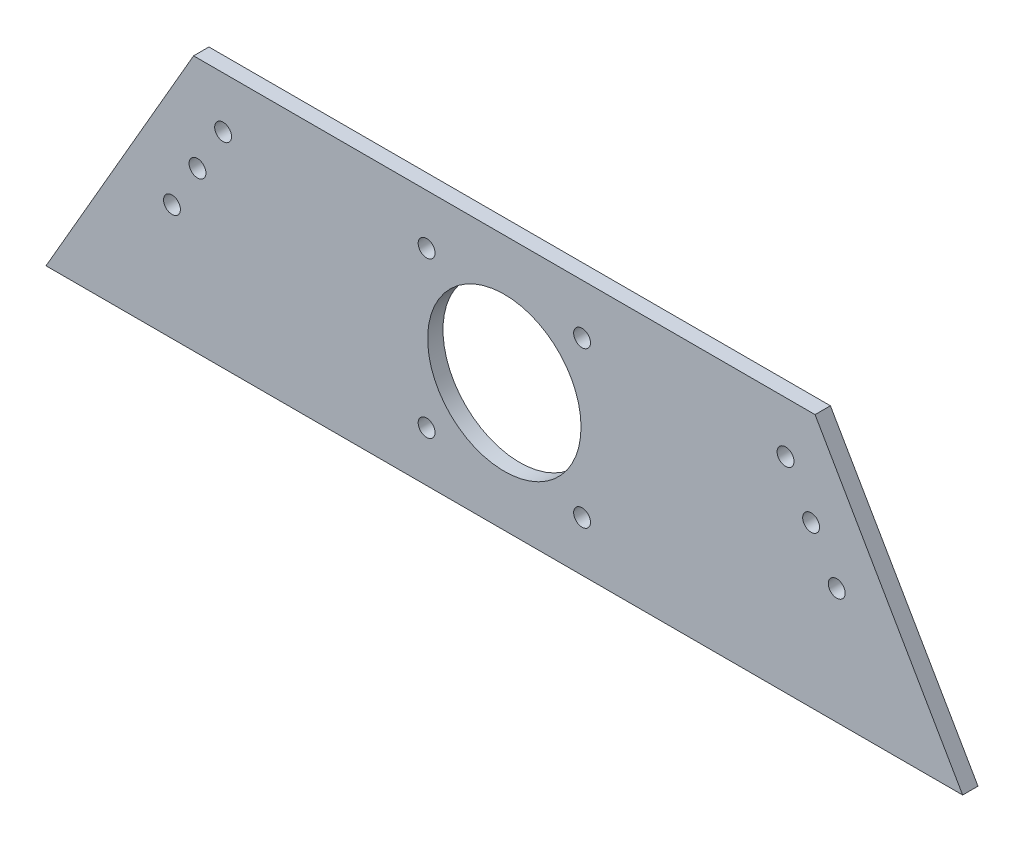
ISO-10303-21;
HEADER;
FILE_DESCRIPTION(('STEP AP214'),'2;1');
FILE_NAME('part.step','',(''),(''),'','','');
FILE_SCHEMA(('AUTOMOTIVE_DESIGN { 1 0 10303 214 1 1 1 1 }'));
ENDSEC;
DATA;
#1=APPLICATION_CONTEXT('core data for automotive mechanical design processes');
#2=APPLICATION_PROTOCOL_DEFINITION('international standard','automotive_design',2000,#1);
#3=PRODUCT_CONTEXT('',#1,'mechanical');
#4=PRODUCT('Part','Part','',(#3));
#5=PRODUCT_RELATED_PRODUCT_CATEGORY('part','',(#4));
#6=PRODUCT_DEFINITION_FORMATION('','',#4);
#7=PRODUCT_DEFINITION_CONTEXT('part definition',#1,'design');
#8=PRODUCT_DEFINITION('design','',#6,#7);
#9=PRODUCT_DEFINITION_SHAPE('','',#8);
#10=(LENGTH_UNIT() NAMED_UNIT(*) SI_UNIT(.MILLI.,.METRE.));
#11=(NAMED_UNIT(*) PLANE_ANGLE_UNIT() SI_UNIT($,.RADIAN.));
#12=(NAMED_UNIT(*) SI_UNIT($,.STERADIAN.) SOLID_ANGLE_UNIT());
#13=UNCERTAINTY_MEASURE_WITH_UNIT(LENGTH_MEASURE(1.E-05),#10,'distance_accuracy_value','');
#14=(GEOMETRIC_REPRESENTATION_CONTEXT(3) GLOBAL_UNCERTAINTY_ASSIGNED_CONTEXT((#13)) GLOBAL_UNIT_ASSIGNED_CONTEXT((#10,
#11,#12)) REPRESENTATION_CONTEXT('',''));
#15=CARTESIAN_POINT('',(0.,0.,0.));
#16=DIRECTION('',(0.,0.,1.));
#17=DIRECTION('',(1.,0.,0.));
#18=AXIS2_PLACEMENT_3D('',#15,#16,#17);
#19=CARTESIAN_POINT('',(0.,0.,3.));
#20=DIRECTION('',(0.,0.,-1.));
#21=DIRECTION('',(-1.,0.,0.));
#22=AXIS2_PLACEMENT_3D('',#19,#20,#21);
#23=PLANE('',#22);
#24=CARTESIAN_POINT('',(-60.,-8.6602540378444,3.));
#25=DIRECTION('',(0.,0.,-1.));
#26=DIRECTION('',(1.,0.,0.));
#27=AXIS2_PLACEMENT_3D('',#24,#25,#26);
#28=CIRCLE('',#27,1.65);
#29=CARTESIAN_POINT('',(-58.35,-8.6602540378444,3.));
#30=VERTEX_POINT('',#29);
#31=EDGE_CURVE('E188',#30,#30,#28,.T.);
#32=ORIENTED_EDGE('',*,*,#31,.T.);
#33=EDGE_LOOP('',(#32));
#34=FACE_BOUND('',#33,.T.);
#35=CARTESIAN_POINT('',(-65.,-17.3205080756888,3.));
#36=DIRECTION('',(0.,0.,-1.));
#37=DIRECTION('',(1.,0.,0.));
#38=AXIS2_PLACEMENT_3D('',#35,#36,#37);
#39=CIRCLE('',#38,1.64999999999999);
#40=CARTESIAN_POINT('',(-63.35,-17.3205080756888,3.));
#41=VERTEX_POINT('',#40);
#42=EDGE_CURVE('E192',#41,#41,#39,.T.);
#43=ORIENTED_EDGE('',*,*,#42,.T.);
#44=EDGE_LOOP('',(#43));
#45=FACE_BOUND('',#44,.T.);
#46=CARTESIAN_POINT('',(65.,-17.3205080756888,3.));
#47=DIRECTION('',(0.,0.,-1.));
#48=DIRECTION('',(-1.,0.,0.));
#49=AXIS2_PLACEMENT_3D('',#46,#47,#48);
#50=CIRCLE('',#49,1.65);
#51=CARTESIAN_POINT('',(63.35,-17.3205080756888,3.));
#52=VERTEX_POINT('',#51);
#53=EDGE_CURVE('E196',#52,#52,#50,.T.);
#54=ORIENTED_EDGE('',*,*,#53,.T.);
#55=EDGE_LOOP('',(#54));
#56=FACE_BOUND('',#55,.T.);
#57=CARTESIAN_POINT('',(60.,-8.6602540378444,3.));
#58=DIRECTION('',(0.,0.,-1.));
#59=DIRECTION('',(-1.,0.,0.));
#60=AXIS2_PLACEMENT_3D('',#57,#58,#59);
#61=CIRCLE('',#60,1.65);
#62=CARTESIAN_POINT('',(58.35,-8.6602540378444,3.));
#63=VERTEX_POINT('',#62);
#64=EDGE_CURVE('E106',#63,#63,#61,.T.);
#65=ORIENTED_EDGE('',*,*,#64,.T.);
#66=EDGE_LOOP('',(#65));
#67=FACE_BOUND('',#66,.T.);
#68=CARTESIAN_POINT('',(15.2027957955108,0.202795795510687,3.));
#69=DIRECTION('',(0.,0.,1.));
#70=DIRECTION('',(-1.,0.,0.));
#71=AXIS2_PLACEMENT_3D('',#68,#69,#70);
#72=CIRCLE('',#71,1.64999999999999);
#73=CARTESIAN_POINT('',(13.5527957955109,0.202795795510687,3.));
#74=VERTEX_POINT('',#73);
#75=EDGE_CURVE('E117',#74,#74,#72,.T.);
#76=ORIENTED_EDGE('',*,*,#75,.F.);
#77=EDGE_LOOP('',(#76));
#78=FACE_BOUND('',#77,.T.);
#79=CARTESIAN_POINT('',(15.2027957955109,-30.2027957955107,3.));
#80=DIRECTION('',(0.,0.,1.));
#81=DIRECTION('',(1.,0.,0.));
#82=AXIS2_PLACEMENT_3D('',#79,#80,#81);
#83=CIRCLE('',#82,1.65);
#84=CARTESIAN_POINT('',(16.8527957955109,-30.2027957955107,3.));
#85=VERTEX_POINT('',#84);
#86=EDGE_CURVE('E137',#85,#85,#83,.T.);
#87=ORIENTED_EDGE('',*,*,#86,.F.);
#88=EDGE_LOOP('',(#87));
#89=FACE_BOUND('',#88,.T.);
#90=CARTESIAN_POINT('',(-15.2027957955109,-30.2027957955107,3.));
#91=DIRECTION('',(0.,0.,1.));
#92=DIRECTION('',(-1.,0.,0.));
#93=AXIS2_PLACEMENT_3D('',#90,#91,#92);
#94=CIRCLE('',#93,1.65);
#95=CARTESIAN_POINT('',(-16.8527957955109,-30.2027957955107,3.));
#96=VERTEX_POINT('',#95);
#97=EDGE_CURVE('E131',#96,#96,#94,.T.);
#98=ORIENTED_EDGE('',*,*,#97,.F.);
#99=EDGE_LOOP('',(#98));
#100=FACE_BOUND('',#99,.T.);
#101=CARTESIAN_POINT('',(-15.2027957955108,0.202795795510687,3.));
#102=DIRECTION('',(0.,0.,1.));
#103=DIRECTION('',(1.,0.,0.));
#104=AXIS2_PLACEMENT_3D('',#101,#102,#103);
#105=CIRCLE('',#104,1.64999999999999);
#106=CARTESIAN_POINT('',(-13.5527957955109,0.202795795510687,3.));
#107=VERTEX_POINT('',#106);
#108=EDGE_CURVE('E125',#107,#107,#105,.T.);
#109=ORIENTED_EDGE('',*,*,#108,.F.);
#110=EDGE_LOOP('',(#109));
#111=FACE_BOUND('',#110,.T.);
#112=CARTESIAN_POINT('',(0.,-15.,3.));
#113=DIRECTION('',(0.,0.,1.));
#114=DIRECTION('',(1.,0.,0.));
#115=AXIS2_PLACEMENT_3D('',#112,#113,#114);
#116=CIRCLE('',#115,15.);
#117=CARTESIAN_POINT('',(15.,-15.,3.));
#118=VERTEX_POINT('',#117);
#119=EDGE_CURVE('E145',#118,#118,#116,.T.);
#120=ORIENTED_EDGE('',*,*,#119,.F.);
#121=EDGE_LOOP('',(#120));
#122=FACE_BOUND('',#121,.T.);
#123=CARTESIAN_POINT('',(-55.,0.,3.));
#124=DIRECTION('',(0.,0.,1.));
#125=DIRECTION('',(1.,0.,0.));
#126=AXIS2_PLACEMENT_3D('',#123,#124,#125);
#127=CIRCLE('',#126,1.65);
#128=CARTESIAN_POINT('',(-53.35,0.,3.));
#129=VERTEX_POINT('',#128);
#130=EDGE_CURVE('E157',#129,#129,#127,.T.);
#131=ORIENTED_EDGE('',*,*,#130,.F.);
#132=EDGE_LOOP('',(#131));
#133=FACE_BOUND('',#132,.T.);
#134=CARTESIAN_POINT('',(55.,0.,3.));
#135=DIRECTION('',(0.,0.,1.));
#136=DIRECTION('',(1.,0.,0.));
#137=AXIS2_PLACEMENT_3D('',#134,#135,#136);
#138=CIRCLE('',#137,1.65);
#139=CARTESIAN_POINT('',(56.65,0.,3.));
#140=VERTEX_POINT('',#139);
#141=EDGE_CURVE('E151',#140,#140,#138,.T.);
#142=ORIENTED_EDGE('',*,*,#141,.F.);
#143=EDGE_LOOP('',(#142));
#144=FACE_BOUND('',#143,.T.);
#145=DIRECTION('',(0.500000000000006,-0.866025403784435,0.));
#146=VECTOR('',#145,1.);
#147=CARTESIAN_POINT('',(60.77,10.,3.));
#148=LINE('',#147,#146);
#149=CARTESIAN_POINT('',(60.77,10.,3.));
#150=VERTEX_POINT('',#149);
#151=CARTESIAN_POINT('',(89.637513459481,-40.,3.));
#152=VERTEX_POINT('',#151);
#153=EDGE_CURVE('E86',#150,#152,#148,.T.);
#154=ORIENTED_EDGE('',*,*,#153,.F.);
#155=DIRECTION('',(-1.,0.,0.));
#156=VECTOR('',#155,1.);
#157=CARTESIAN_POINT('',(-65.,10.,3.));
#158=LINE('',#157,#156);
#159=CARTESIAN_POINT('',(-60.77,10.,3.));
#160=VERTEX_POINT('',#159);
#161=EDGE_CURVE('E11',#150,#160,#158,.T.);
#162=ORIENTED_EDGE('',*,*,#161,.T.);
#163=DIRECTION('',(0.500000000000006,0.866025403784435,0.));
#164=VECTOR('',#163,1.);
#165=CARTESIAN_POINT('',(-60.77,10.,3.));
#166=LINE('',#165,#164);
#167=CARTESIAN_POINT('',(-89.637513459481,-40.,3.));
#168=VERTEX_POINT('',#167);
#169=EDGE_CURVE('E76',#168,#160,#166,.T.);
#170=ORIENTED_EDGE('',*,*,#169,.F.);
#171=DIRECTION('',(1.,0.,0.));
#172=VECTOR('',#171,1.);
#173=CARTESIAN_POINT('',(-65.,-40.,3.));
#174=LINE('',#173,#172);
#175=EDGE_CURVE('E99',#168,#152,#174,.T.);
#176=ORIENTED_EDGE('',*,*,#175,.T.);
#177=EDGE_LOOP('',(#154,#162,#170,#176));
#178=FACE_BOUND('',#177,.T.);
#179=ADVANCED_FACE('F43',(#34,#45,#56,#67,#78,#89,#100,#111,#122,#133,#144,#178),#23,.F.);
#180=CARTESIAN_POINT('',(0.,0.,0.));
#181=DIRECTION('',(0.,0.,-1.));
#182=DIRECTION('',(-1.,0.,0.));
#183=AXIS2_PLACEMENT_3D('',#180,#181,#182);
#184=PLANE('',#183);
#185=CARTESIAN_POINT('',(-60.,-8.6602540378444,0.));
#186=DIRECTION('',(0.,0.,-1.));
#187=DIRECTION('',(1.,0.,0.));
#188=AXIS2_PLACEMENT_3D('',#185,#186,#187);
#189=CIRCLE('',#188,1.65);
#190=CARTESIAN_POINT('',(-58.35,-8.6602540378444,0.));
#191=VERTEX_POINT('',#190);
#192=EDGE_CURVE('E386',#191,#191,#189,.T.);
#193=ORIENTED_EDGE('',*,*,#192,.F.);
#194=EDGE_LOOP('',(#193));
#195=FACE_BOUND('',#194,.T.);
#196=CARTESIAN_POINT('',(-65.,-17.3205080756888,0.));
#197=DIRECTION('',(0.,0.,-1.));
#198=DIRECTION('',(1.,0.,0.));
#199=AXIS2_PLACEMENT_3D('',#196,#197,#198);
#200=CIRCLE('',#199,1.64999999999999);
#201=CARTESIAN_POINT('',(-63.35,-17.3205080756888,0.));
#202=VERTEX_POINT('',#201);
#203=EDGE_CURVE('E388',#202,#202,#200,.T.);
#204=ORIENTED_EDGE('',*,*,#203,.F.);
#205=EDGE_LOOP('',(#204));
#206=FACE_BOUND('',#205,.T.);
#207=CARTESIAN_POINT('',(65.,-17.3205080756888,0.));
#208=DIRECTION('',(0.,0.,-1.));
#209=DIRECTION('',(-1.,0.,0.));
#210=AXIS2_PLACEMENT_3D('',#207,#208,#209);
#211=CIRCLE('',#210,1.65);
#212=CARTESIAN_POINT('',(63.35,-17.3205080756888,0.));
#213=VERTEX_POINT('',#212);
#214=EDGE_CURVE('E393',#213,#213,#211,.T.);
#215=ORIENTED_EDGE('',*,*,#214,.F.);
#216=EDGE_LOOP('',(#215));
#217=FACE_BOUND('',#216,.T.);
#218=CARTESIAN_POINT('',(60.,-8.6602540378444,0.));
#219=DIRECTION('',(0.,0.,-1.));
#220=DIRECTION('',(-1.,0.,0.));
#221=AXIS2_PLACEMENT_3D('',#218,#219,#220);
#222=CIRCLE('',#221,1.65);
#223=CARTESIAN_POINT('',(58.35,-8.6602540378444,0.));
#224=VERTEX_POINT('',#223);
#225=EDGE_CURVE('E111',#224,#224,#222,.T.);
#226=ORIENTED_EDGE('',*,*,#225,.F.);
#227=EDGE_LOOP('',(#226));
#228=FACE_BOUND('',#227,.T.);
#229=CARTESIAN_POINT('',(15.2027957955108,0.202795795510687,0.));
#230=DIRECTION('',(0.,0.,1.));
#231=DIRECTION('',(-1.,0.,0.));
#232=AXIS2_PLACEMENT_3D('',#229,#230,#231);
#233=CIRCLE('',#232,1.64999999999999);
#234=CARTESIAN_POINT('',(13.5527957955109,0.202795795510687,0.));
#235=VERTEX_POINT('',#234);
#236=EDGE_CURVE('E140',#235,#235,#233,.T.);
#237=ORIENTED_EDGE('',*,*,#236,.T.);
#238=EDGE_LOOP('',(#237));
#239=FACE_BOUND('',#238,.T.);
#240=CARTESIAN_POINT('',(15.2027957955109,-30.2027957955107,0.));
#241=DIRECTION('',(0.,0.,1.));
#242=DIRECTION('',(1.,0.,0.));
#243=AXIS2_PLACEMENT_3D('',#240,#241,#242);
#244=CIRCLE('',#243,1.65);
#245=CARTESIAN_POINT('',(16.8527957955109,-30.2027957955107,0.));
#246=VERTEX_POINT('',#245);
#247=EDGE_CURVE('E134',#246,#246,#244,.T.);
#248=ORIENTED_EDGE('',*,*,#247,.T.);
#249=EDGE_LOOP('',(#248));
#250=FACE_BOUND('',#249,.T.);
#251=CARTESIAN_POINT('',(-15.2027957955109,-30.2027957955107,0.));
#252=DIRECTION('',(0.,0.,1.));
#253=DIRECTION('',(-1.,0.,0.));
#254=AXIS2_PLACEMENT_3D('',#251,#252,#253);
#255=CIRCLE('',#254,1.65);
#256=CARTESIAN_POINT('',(-16.8527957955109,-30.2027957955107,0.));
#257=VERTEX_POINT('',#256);
#258=EDGE_CURVE('E128',#257,#257,#255,.T.);
#259=ORIENTED_EDGE('',*,*,#258,.T.);
#260=EDGE_LOOP('',(#259));
#261=FACE_BOUND('',#260,.T.);
#262=CARTESIAN_POINT('',(-15.2027957955108,0.202795795510687,0.));
#263=DIRECTION('',(0.,0.,1.));
#264=DIRECTION('',(1.,0.,0.));
#265=AXIS2_PLACEMENT_3D('',#262,#263,#264);
#266=CIRCLE('',#265,1.64999999999999);
#267=CARTESIAN_POINT('',(-13.5527957955109,0.202795795510687,0.));
#268=VERTEX_POINT('',#267);
#269=EDGE_CURVE('E121',#268,#268,#266,.T.);
#270=ORIENTED_EDGE('',*,*,#269,.T.);
#271=EDGE_LOOP('',(#270));
#272=FACE_BOUND('',#271,.T.);
#273=CARTESIAN_POINT('',(0.,-15.,0.));
#274=DIRECTION('',(0.,0.,1.));
#275=DIRECTION('',(1.,0.,0.));
#276=AXIS2_PLACEMENT_3D('',#273,#274,#275);
#277=CIRCLE('',#276,15.);
#278=CARTESIAN_POINT('',(15.,-15.,0.));
#279=VERTEX_POINT('',#278);
#280=EDGE_CURVE('E124',#279,#279,#277,.T.);
#281=ORIENTED_EDGE('',*,*,#280,.T.);
#282=EDGE_LOOP('',(#281));
#283=FACE_BOUND('',#282,.T.);
#284=CARTESIAN_POINT('',(-55.,0.,0.));
#285=DIRECTION('',(0.,0.,1.));
#286=DIRECTION('',(1.,0.,0.));
#287=AXIS2_PLACEMENT_3D('',#284,#285,#286);
#288=CIRCLE('',#287,1.65);
#289=CARTESIAN_POINT('',(-53.35,0.,0.));
#290=VERTEX_POINT('',#289);
#291=EDGE_CURVE('E154',#290,#290,#288,.T.);
#292=ORIENTED_EDGE('',*,*,#291,.T.);
#293=EDGE_LOOP('',(#292));
#294=FACE_BOUND('',#293,.T.);
#295=CARTESIAN_POINT('',(55.,0.,0.));
#296=DIRECTION('',(0.,0.,1.));
#297=DIRECTION('',(1.,0.,0.));
#298=AXIS2_PLACEMENT_3D('',#295,#296,#297);
#299=CIRCLE('',#298,1.65);
#300=CARTESIAN_POINT('',(56.65,0.,0.));
#301=VERTEX_POINT('',#300);
#302=EDGE_CURVE('E98',#301,#301,#299,.T.);
#303=ORIENTED_EDGE('',*,*,#302,.T.);
#304=EDGE_LOOP('',(#303));
#305=FACE_BOUND('',#304,.T.);
#306=DIRECTION('',(-1.,0.,0.));
#307=VECTOR('',#306,1.);
#308=CARTESIAN_POINT('',(-65.,10.,0.));
#309=LINE('',#308,#307);
#310=CARTESIAN_POINT('',(60.77,10.,0.));
#311=VERTEX_POINT('',#310);
#312=CARTESIAN_POINT('',(-60.77,10.,0.));
#313=VERTEX_POINT('',#312);
#314=EDGE_CURVE('E47',#311,#313,#309,.T.);
#315=ORIENTED_EDGE('',*,*,#314,.F.);
#316=DIRECTION('',(0.500000000000006,-0.866025403784435,0.));
#317=VECTOR('',#316,1.);
#318=CARTESIAN_POINT('',(60.77,10.,0.));
#319=LINE('',#318,#317);
#320=CARTESIAN_POINT('',(89.637513459481,-40.,0.));
#321=VERTEX_POINT('',#320);
#322=EDGE_CURVE('E58',#311,#321,#319,.T.);
#323=ORIENTED_EDGE('',*,*,#322,.T.);
#324=DIRECTION('',(1.,0.,0.));
#325=VECTOR('',#324,1.);
#326=CARTESIAN_POINT('',(-65.,-40.,0.));
#327=LINE('',#326,#325);
#328=CARTESIAN_POINT('',(-89.637513459481,-40.,0.));
#329=VERTEX_POINT('',#328);
#330=EDGE_CURVE('E92',#329,#321,#327,.T.);
#331=ORIENTED_EDGE('',*,*,#330,.F.);
#332=DIRECTION('',(0.500000000000006,0.866025403784435,0.));
#333=VECTOR('',#332,1.);
#334=CARTESIAN_POINT('',(-60.77,10.,0.));
#335=LINE('',#334,#333);
#336=EDGE_CURVE('E82',#329,#313,#335,.T.);
#337=ORIENTED_EDGE('',*,*,#336,.T.);
#338=EDGE_LOOP('',(#315,#323,#331,#337));
#339=FACE_BOUND('',#338,.T.);
#340=ADVANCED_FACE('F102',(#195,#206,#217,#228,#239,#250,#261,#272,#283,#294,#305,#339),#184,.T.);
#341=CARTESIAN_POINT('',(-65.,10.,3.));
#342=DIRECTION('',(0.,-1.,0.));
#343=DIRECTION('',(0.,0.,-1.));
#344=AXIS2_PLACEMENT_3D('',#341,#342,#343);
#345=PLANE('',#344);
#346=DIRECTION('',(0.,0.,-1.));
#347=VECTOR('',#346,1.);
#348=CARTESIAN_POINT('',(60.77,10.,3.));
#349=LINE('',#348,#347);
#350=EDGE_CURVE('E63',#150,#311,#349,.T.);
#351=ORIENTED_EDGE('',*,*,#350,.T.);
#352=ORIENTED_EDGE('',*,*,#314,.T.);
#353=DIRECTION('',(0.,0.,-1.));
#354=VECTOR('',#353,1.);
#355=CARTESIAN_POINT('',(-60.77,10.,3.));
#356=LINE('',#355,#354);
#357=EDGE_CURVE('E108',#160,#313,#356,.T.);
#358=ORIENTED_EDGE('',*,*,#357,.F.);
#359=ORIENTED_EDGE('',*,*,#161,.F.);
#360=EDGE_LOOP('',(#351,#352,#358,#359));
#361=FACE_BOUND('',#360,.T.);
#362=ADVANCED_FACE('F45',(#361),#345,.F.);
#363=CARTESIAN_POINT('',(-55.,0.,3.));
#364=DIRECTION('',(0.,0.,-1.));
#365=DIRECTION('',(-1.,0.,0.));
#366=AXIS2_PLACEMENT_3D('',#363,#364,#365);
#367=CYLINDRICAL_SURFACE('',#366,1.65);
#368=ORIENTED_EDGE('',*,*,#130,.T.);
#369=EDGE_LOOP('',(#368));
#370=FACE_BOUND('',#369,.T.);
#371=ORIENTED_EDGE('',*,*,#291,.F.);
#372=EDGE_LOOP('',(#371));
#373=FACE_BOUND('',#372,.T.);
#374=ADVANCED_FACE('F165',(#370,#373),#367,.F.);
#375=CARTESIAN_POINT('',(55.,0.,3.));
#376=DIRECTION('',(0.,0.,-1.));
#377=DIRECTION('',(-1.,0.,0.));
#378=AXIS2_PLACEMENT_3D('',#375,#376,#377);
#379=CYLINDRICAL_SURFACE('',#378,1.65);
#380=ORIENTED_EDGE('',*,*,#141,.T.);
#381=EDGE_LOOP('',(#380));
#382=FACE_BOUND('',#381,.T.);
#383=ORIENTED_EDGE('',*,*,#302,.F.);
#384=EDGE_LOOP('',(#383));
#385=FACE_BOUND('',#384,.T.);
#386=ADVANCED_FACE('F167',(#382,#385),#379,.F.);
#387=CARTESIAN_POINT('',(-65.,-40.,0.));
#388=DIRECTION('',(0.,-1.,0.));
#389=DIRECTION('',(0.,0.,-1.));
#390=AXIS2_PLACEMENT_3D('',#387,#388,#389);
#391=PLANE('',#390);
#392=ORIENTED_EDGE('',*,*,#175,.F.);
#393=DIRECTION('',(0.,0.,1.));
#394=VECTOR('',#393,1.);
#395=CARTESIAN_POINT('',(-89.637513459481,-40.,0.));
#396=LINE('',#395,#394);
#397=EDGE_CURVE('E96',#329,#168,#396,.T.);
#398=ORIENTED_EDGE('',*,*,#397,.F.);
#399=ORIENTED_EDGE('',*,*,#330,.T.);
#400=DIRECTION('',(0.,0.,1.));
#401=VECTOR('',#400,1.);
#402=CARTESIAN_POINT('',(89.637513459481,-40.,0.));
#403=LINE('',#402,#401);
#404=EDGE_CURVE('E95',#321,#152,#403,.T.);
#405=ORIENTED_EDGE('',*,*,#404,.T.);
#406=EDGE_LOOP('',(#392,#398,#399,#405));
#407=FACE_BOUND('',#406,.T.);
#408=ADVANCED_FACE('F94',(#407),#391,.T.);
#409=CARTESIAN_POINT('',(0.,-15.,3.));
#410=DIRECTION('',(0.,0.,-1.));
#411=DIRECTION('',(-1.,0.,0.));
#412=AXIS2_PLACEMENT_3D('',#409,#410,#411);
#413=CYLINDRICAL_SURFACE('',#412,15.);
#414=ORIENTED_EDGE('',*,*,#119,.T.);
#415=EDGE_LOOP('',(#414));
#416=FACE_BOUND('',#415,.T.);
#417=ORIENTED_EDGE('',*,*,#280,.F.);
#418=EDGE_LOOP('',(#417));
#419=FACE_BOUND('',#418,.T.);
#420=ADVANCED_FACE('F233',(#416,#419),#413,.F.);
#421=CARTESIAN_POINT('',(-15.2027957955108,0.202795795510687,3.));
#422=DIRECTION('',(0.,0.,-1.));
#423=DIRECTION('',(-1.,0.,0.));
#424=AXIS2_PLACEMENT_3D('',#421,#422,#423);
#425=CYLINDRICAL_SURFACE('',#424,1.64999999999999);
#426=ORIENTED_EDGE('',*,*,#108,.T.);
#427=EDGE_LOOP('',(#426));
#428=FACE_BOUND('',#427,.T.);
#429=ORIENTED_EDGE('',*,*,#269,.F.);
#430=EDGE_LOOP('',(#429));
#431=FACE_BOUND('',#430,.T.);
#432=ADVANCED_FACE('F229',(#428,#431),#425,.F.);
#433=CARTESIAN_POINT('',(-15.2027957955109,-30.2027957955107,3.));
#434=DIRECTION('',(0.,0.,-1.));
#435=DIRECTION('',(-1.,0.,0.));
#436=AXIS2_PLACEMENT_3D('',#433,#434,#435);
#437=CYLINDRICAL_SURFACE('',#436,1.65);
#438=ORIENTED_EDGE('',*,*,#97,.T.);
#439=EDGE_LOOP('',(#438));
#440=FACE_BOUND('',#439,.T.);
#441=ORIENTED_EDGE('',*,*,#258,.F.);
#442=EDGE_LOOP('',(#441));
#443=FACE_BOUND('',#442,.T.);
#444=ADVANCED_FACE('F232',(#440,#443),#437,.F.);
#445=CARTESIAN_POINT('',(15.2027957955109,-30.2027957955107,3.));
#446=DIRECTION('',(0.,0.,-1.));
#447=DIRECTION('',(-1.,0.,0.));
#448=AXIS2_PLACEMENT_3D('',#445,#446,#447);
#449=CYLINDRICAL_SURFACE('',#448,1.65);
#450=ORIENTED_EDGE('',*,*,#86,.T.);
#451=EDGE_LOOP('',(#450));
#452=FACE_BOUND('',#451,.T.);
#453=ORIENTED_EDGE('',*,*,#247,.F.);
#454=EDGE_LOOP('',(#453));
#455=FACE_BOUND('',#454,.T.);
#456=ADVANCED_FACE('F224',(#452,#455),#449,.F.);
#457=CARTESIAN_POINT('',(15.2027957955108,0.202795795510687,3.));
#458=DIRECTION('',(0.,0.,-1.));
#459=DIRECTION('',(-1.,0.,0.));
#460=AXIS2_PLACEMENT_3D('',#457,#458,#459);
#461=CYLINDRICAL_SURFACE('',#460,1.64999999999999);
#462=ORIENTED_EDGE('',*,*,#75,.T.);
#463=EDGE_LOOP('',(#462));
#464=FACE_BOUND('',#463,.T.);
#465=ORIENTED_EDGE('',*,*,#236,.F.);
#466=EDGE_LOOP('',(#465));
#467=FACE_BOUND('',#466,.T.);
#468=ADVANCED_FACE('F216',(#464,#467),#461,.F.);
#469=CARTESIAN_POINT('',(-60.77,10.,3.));
#470=DIRECTION('',(-0.866025403784435,0.500000000000006,0.));
#471=DIRECTION('',(-0.500000000000006,-0.866025403784435,0.));
#472=AXIS2_PLACEMENT_3D('',#469,#470,#471);
#473=PLANE('',#472);
#474=ORIENTED_EDGE('',*,*,#336,.F.);
#475=ORIENTED_EDGE('',*,*,#397,.T.);
#476=ORIENTED_EDGE('',*,*,#169,.T.);
#477=ORIENTED_EDGE('',*,*,#357,.T.);
#478=EDGE_LOOP('',(#474,#475,#476,#477));
#479=FACE_BOUND('',#478,.T.);
#480=ADVANCED_FACE('F214',(#479),#473,.T.);
#481=CARTESIAN_POINT('',(60.77,10.,3.));
#482=DIRECTION('',(0.866025403784435,0.500000000000006,0.));
#483=DIRECTION('',(-0.500000000000006,0.866025403784435,0.));
#484=AXIS2_PLACEMENT_3D('',#481,#482,#483);
#485=PLANE('',#484);
#486=ORIENTED_EDGE('',*,*,#322,.F.);
#487=ORIENTED_EDGE('',*,*,#350,.F.);
#488=ORIENTED_EDGE('',*,*,#153,.T.);
#489=ORIENTED_EDGE('',*,*,#404,.F.);
#490=EDGE_LOOP('',(#486,#487,#488,#489));
#491=FACE_BOUND('',#490,.T.);
#492=ADVANCED_FACE('F105',(#491),#485,.T.);
#493=CARTESIAN_POINT('',(60.,-8.6602540378444,3.));
#494=DIRECTION('',(0.,0.,-1.));
#495=DIRECTION('',(-1.,0.,0.));
#496=AXIS2_PLACEMENT_3D('',#493,#494,#495);
#497=CYLINDRICAL_SURFACE('',#496,1.65);
#498=ORIENTED_EDGE('',*,*,#64,.F.);
#499=EDGE_LOOP('',(#498));
#500=FACE_BOUND('',#499,.T.);
#501=ORIENTED_EDGE('',*,*,#225,.T.);
#502=EDGE_LOOP('',(#501));
#503=FACE_BOUND('',#502,.T.);
#504=ADVANCED_FACE('F221',(#500,#503),#497,.F.);
#505=CARTESIAN_POINT('',(65.,-17.3205080756888,3.));
#506=DIRECTION('',(0.,0.,-1.));
#507=DIRECTION('',(-1.,0.,0.));
#508=AXIS2_PLACEMENT_3D('',#505,#506,#507);
#509=CYLINDRICAL_SURFACE('',#508,1.65);
#510=ORIENTED_EDGE('',*,*,#53,.F.);
#511=EDGE_LOOP('',(#510));
#512=FACE_BOUND('',#511,.T.);
#513=ORIENTED_EDGE('',*,*,#214,.T.);
#514=EDGE_LOOP('',(#513));
#515=FACE_BOUND('',#514,.T.);
#516=ADVANCED_FACE('F308',(#512,#515),#509,.F.);
#517=CARTESIAN_POINT('',(-65.,-17.3205080756888,3.));
#518=DIRECTION('',(0.,0.,-1.));
#519=DIRECTION('',(-1.,0.,0.));
#520=AXIS2_PLACEMENT_3D('',#517,#518,#519);
#521=CYLINDRICAL_SURFACE('',#520,1.64999999999999);
#522=ORIENTED_EDGE('',*,*,#42,.F.);
#523=EDGE_LOOP('',(#522));
#524=FACE_BOUND('',#523,.T.);
#525=ORIENTED_EDGE('',*,*,#203,.T.);
#526=EDGE_LOOP('',(#525));
#527=FACE_BOUND('',#526,.T.);
#528=ADVANCED_FACE('F317',(#524,#527),#521,.F.);
#529=CARTESIAN_POINT('',(-60.,-8.6602540378444,3.));
#530=DIRECTION('',(0.,0.,-1.));
#531=DIRECTION('',(-1.,0.,0.));
#532=AXIS2_PLACEMENT_3D('',#529,#530,#531);
#533=CYLINDRICAL_SURFACE('',#532,1.65);
#534=ORIENTED_EDGE('',*,*,#31,.F.);
#535=EDGE_LOOP('',(#534));
#536=FACE_BOUND('',#535,.T.);
#537=ORIENTED_EDGE('',*,*,#192,.T.);
#538=EDGE_LOOP('',(#537));
#539=FACE_BOUND('',#538,.T.);
#540=ADVANCED_FACE('F326',(#536,#539),#533,.F.);
#541=CLOSED_SHELL('',(#179,#340,#362,#374,#386,#408,#420,#432,#444,#456,#468,#480,#492,#504,
#516,#528,#540));
#542=MANIFOLD_SOLID_BREP('B2',#541);
#543=ADVANCED_BREP_SHAPE_REPRESENTATION('',(#18,#542),#14);
#544=SHAPE_DEFINITION_REPRESENTATION(#9,#543);
ENDSEC;
END-ISO-10303-21;
